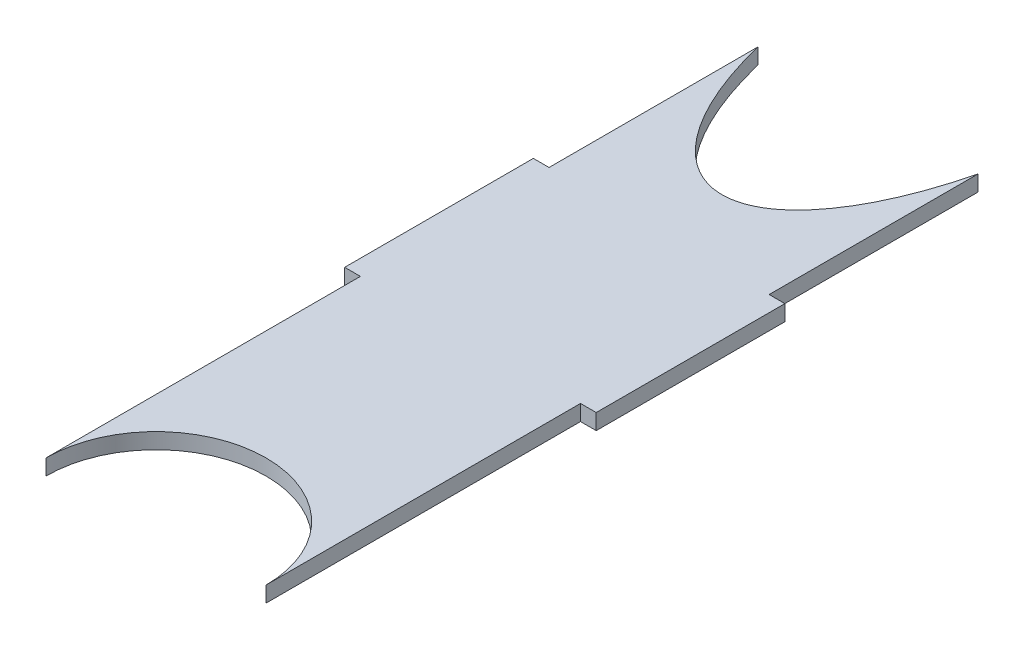
ISO-10303-21;
HEADER;
FILE_DESCRIPTION(('STEP AP214'),'2;1');
FILE_NAME('part.step','',(''),(''),'','','');
FILE_SCHEMA(('AUTOMOTIVE_DESIGN { 1 0 10303 214 1 1 1 1 }'));
ENDSEC;
DATA;
#1=APPLICATION_CONTEXT('core data for automotive mechanical design processes');
#2=APPLICATION_PROTOCOL_DEFINITION('international standard','automotive_design',2000,#1);
#3=PRODUCT_CONTEXT('',#1,'mechanical');
#4=PRODUCT('Part','Part','',(#3));
#5=PRODUCT_RELATED_PRODUCT_CATEGORY('part','',(#4));
#6=PRODUCT_DEFINITION_FORMATION('','',#4);
#7=PRODUCT_DEFINITION_CONTEXT('part definition',#1,'design');
#8=PRODUCT_DEFINITION('design','',#6,#7);
#9=PRODUCT_DEFINITION_SHAPE('','',#8);
#10=(LENGTH_UNIT() NAMED_UNIT(*) SI_UNIT(.MILLI.,.METRE.));
#11=(NAMED_UNIT(*) PLANE_ANGLE_UNIT() SI_UNIT($,.RADIAN.));
#12=(NAMED_UNIT(*) SI_UNIT($,.STERADIAN.) SOLID_ANGLE_UNIT());
#13=UNCERTAINTY_MEASURE_WITH_UNIT(LENGTH_MEASURE(1.E-05),#10,'distance_accuracy_value','');
#14=(GEOMETRIC_REPRESENTATION_CONTEXT(3) GLOBAL_UNCERTAINTY_ASSIGNED_CONTEXT((#13)) GLOBAL_UNIT_ASSIGNED_CONTEXT((#10,
#11,#12)) REPRESENTATION_CONTEXT('',''));
#15=CARTESIAN_POINT('',(0.,0.,0.));
#16=DIRECTION('',(0.,0.,1.));
#17=DIRECTION('',(1.,0.,0.));
#18=AXIS2_PLACEMENT_3D('',#15,#16,#17);
#19=CARTESIAN_POINT('',(0.,1.5875,-42.8625));
#20=DIRECTION('',(0.,1.,0.));
#21=DIRECTION('',(0.,0.,1.));
#22=AXIS2_PLACEMENT_3D('',#19,#20,#21);
#23=ELLIPSE('',#22,28.575,12.7);
#24=DIRECTION('',(0.,-1.,0.));
#25=VECTOR('',#24,1.);
#26=SURFACE_OF_LINEAR_EXTRUSION('',#23,#25);
#27=CARTESIAN_POINT('',(0.,0.,-42.8625));
#28=DIRECTION('',(0.,1.,0.));
#29=DIRECTION('',(0.,0.,1.));
#30=AXIS2_PLACEMENT_3D('',#27,#28,#29);
#31=ELLIPSE('',#30,28.575,12.7);
#32=CARTESIAN_POINT('',(-11.1125,0.,-29.0286876102654));
#33=VERTEX_POINT('',#32);
#34=CARTESIAN_POINT('',(11.1125,0.,-29.0286876102654));
#35=VERTEX_POINT('',#34);
#36=EDGE_CURVE('E155',#33,#35,#31,.T.);
#37=ORIENTED_EDGE('',*,*,#36,.F.);
#38=DIRECTION('',(0.,-1.,0.));
#39=VECTOR('',#38,1.);
#40=CARTESIAN_POINT('',(-11.1125,1.5875,-29.0286876102654));
#41=LINE('',#40,#39);
#42=CARTESIAN_POINT('',(-11.1125,1.5875,-29.0286876102654));
#43=VERTEX_POINT('',#42);
#44=EDGE_CURVE('E11',#43,#33,#41,.T.);
#45=ORIENTED_EDGE('',*,*,#44,.F.);
#46=CARTESIAN_POINT('',(11.1125,1.5875,-29.0286876102654));
#47=VERTEX_POINT('',#46);
#48=EDGE_CURVE('E259',#43,#47,#23,.T.);
#49=ORIENTED_EDGE('',*,*,#48,.T.);
#50=DIRECTION('',(0.,-1.,0.));
#51=VECTOR('',#50,1.);
#52=CARTESIAN_POINT('',(11.1125,1.5875,-29.0286876102654));
#53=LINE('',#52,#51);
#54=EDGE_CURVE('E51',#47,#35,#53,.T.);
#55=ORIENTED_EDGE('',*,*,#54,.T.);
#56=EDGE_LOOP('',(#37,#45,#49,#55));
#57=FACE_BOUND('',#56,.T.);
#58=ADVANCED_FACE('F34',(#57),#26,.T.);
#59=CARTESIAN_POINT('',(-11.1125,1.5875,0.));
#60=DIRECTION('',(1.,0.,0.));
#61=DIRECTION('',(0.,0.,-1.));
#62=AXIS2_PLACEMENT_3D('',#59,#60,#61);
#63=PLANE('',#62);
#64=DIRECTION('',(0.,0.,1.));
#65=VECTOR('',#64,1.);
#66=CARTESIAN_POINT('',(-11.1125,0.,0.));
#67=LINE('',#66,#65);
#68=CARTESIAN_POINT('',(-11.1125,0.,-7.93749999999999));
#69=VERTEX_POINT('',#68);
#70=EDGE_CURVE('E157',#33,#69,#67,.T.);
#71=ORIENTED_EDGE('',*,*,#70,.T.);
#72=DIRECTION('',(0.,-1.,0.));
#73=VECTOR('',#72,1.);
#74=CARTESIAN_POINT('',(-11.1125,1.5875,-7.93749999999999));
#75=LINE('',#74,#73);
#76=CARTESIAN_POINT('',(-11.1125,1.5875,-7.93749999999999));
#77=VERTEX_POINT('',#76);
#78=EDGE_CURVE('E43',#77,#69,#75,.T.);
#79=ORIENTED_EDGE('',*,*,#78,.F.);
#80=DIRECTION('',(0.,0.,1.));
#81=VECTOR('',#80,1.);
#82=CARTESIAN_POINT('',(-11.1125,1.5875,0.));
#83=LINE('',#82,#81);
#84=EDGE_CURVE('E221',#43,#77,#83,.T.);
#85=ORIENTED_EDGE('',*,*,#84,.F.);
#86=ORIENTED_EDGE('',*,*,#44,.T.);
#87=EDGE_LOOP('',(#71,#79,#85,#86));
#88=FACE_BOUND('',#87,.T.);
#89=ADVANCED_FACE('F252',(#88),#63,.F.);
#90=CARTESIAN_POINT('',(0.,1.5875,-7.93749999999999));
#91=DIRECTION('',(0.,0.,1.));
#92=DIRECTION('',(1.,0.,0.));
#93=AXIS2_PLACEMENT_3D('',#90,#91,#92);
#94=PLANE('',#93);
#95=DIRECTION('',(-1.,0.,0.));
#96=VECTOR('',#95,1.);
#97=CARTESIAN_POINT('',(0.,0.,-7.93749999999999));
#98=LINE('',#97,#96);
#99=CARTESIAN_POINT('',(-12.7,0.,-7.93749999999999));
#100=VERTEX_POINT('',#99);
#101=EDGE_CURVE('E159',#69,#100,#98,.T.);
#102=ORIENTED_EDGE('',*,*,#101,.T.);
#103=DIRECTION('',(0.,-1.,0.));
#104=VECTOR('',#103,1.);
#105=CARTESIAN_POINT('',(-12.7,1.5875,-7.93749999999999));
#106=LINE('',#105,#104);
#107=CARTESIAN_POINT('',(-12.7,1.5875,-7.93749999999999));
#108=VERTEX_POINT('',#107);
#109=EDGE_CURVE('E194',#108,#100,#106,.T.);
#110=ORIENTED_EDGE('',*,*,#109,.F.);
#111=DIRECTION('',(-1.,0.,0.));
#112=VECTOR('',#111,1.);
#113=CARTESIAN_POINT('',(0.,1.5875,-7.93749999999999));
#114=LINE('',#113,#112);
#115=EDGE_CURVE('E202',#77,#108,#114,.T.);
#116=ORIENTED_EDGE('',*,*,#115,.F.);
#117=ORIENTED_EDGE('',*,*,#78,.T.);
#118=EDGE_LOOP('',(#102,#110,#116,#117));
#119=FACE_BOUND('',#118,.T.);
#120=ADVANCED_FACE('F200',(#119),#94,.F.);
#121=CARTESIAN_POINT('',(-12.7,1.5875,0.));
#122=DIRECTION('',(-1.,0.,0.));
#123=DIRECTION('',(0.,0.,1.));
#124=AXIS2_PLACEMENT_3D('',#121,#122,#123);
#125=PLANE('',#124);
#126=DIRECTION('',(0.,0.,-1.));
#127=VECTOR('',#126,1.);
#128=CARTESIAN_POINT('',(-12.7,0.,0.));
#129=LINE('',#128,#127);
#130=CARTESIAN_POINT('',(-12.7,0.,11.1125));
#131=VERTEX_POINT('',#130);
#132=EDGE_CURVE('E163',#131,#100,#129,.T.);
#133=ORIENTED_EDGE('',*,*,#132,.F.);
#134=DIRECTION('',(0.,-1.,0.));
#135=VECTOR('',#134,1.);
#136=CARTESIAN_POINT('',(-12.7,1.5875,11.1125));
#137=LINE('',#136,#135);
#138=CARTESIAN_POINT('',(-12.7,1.5875,11.1125));
#139=VERTEX_POINT('',#138);
#140=EDGE_CURVE('E192',#139,#131,#137,.T.);
#141=ORIENTED_EDGE('',*,*,#140,.F.);
#142=DIRECTION('',(0.,0.,-1.));
#143=VECTOR('',#142,1.);
#144=CARTESIAN_POINT('',(-12.7,1.5875,0.));
#145=LINE('',#144,#143);
#146=EDGE_CURVE('E214',#139,#108,#145,.T.);
#147=ORIENTED_EDGE('',*,*,#146,.T.);
#148=ORIENTED_EDGE('',*,*,#109,.T.);
#149=EDGE_LOOP('',(#133,#141,#147,#148));
#150=FACE_BOUND('',#149,.T.);
#151=ADVANCED_FACE('F211',(#150),#125,.T.);
#152=CARTESIAN_POINT('',(0.,1.5875,11.1125));
#153=DIRECTION('',(0.,0.,1.));
#154=DIRECTION('',(1.,0.,0.));
#155=AXIS2_PLACEMENT_3D('',#152,#153,#154);
#156=PLANE('',#155);
#157=DIRECTION('',(-1.,0.,0.));
#158=VECTOR('',#157,1.);
#159=CARTESIAN_POINT('',(0.,0.,11.1125));
#160=LINE('',#159,#158);
#161=CARTESIAN_POINT('',(-11.1125,0.,11.1125));
#162=VERTEX_POINT('',#161);
#163=EDGE_CURVE('E166',#162,#131,#160,.T.);
#164=ORIENTED_EDGE('',*,*,#163,.F.);
#165=DIRECTION('',(0.,-1.,0.));
#166=VECTOR('',#165,1.);
#167=CARTESIAN_POINT('',(-11.1125,1.5875,11.1125));
#168=LINE('',#167,#166);
#169=CARTESIAN_POINT('',(-11.1125,1.5875,11.1125));
#170=VERTEX_POINT('',#169);
#171=EDGE_CURVE('E190',#170,#162,#168,.T.);
#172=ORIENTED_EDGE('',*,*,#171,.F.);
#173=DIRECTION('',(-1.,0.,0.));
#174=VECTOR('',#173,1.);
#175=CARTESIAN_POINT('',(0.,1.5875,11.1125));
#176=LINE('',#175,#174);
#177=EDGE_CURVE('E217',#170,#139,#176,.T.);
#178=ORIENTED_EDGE('',*,*,#177,.T.);
#179=ORIENTED_EDGE('',*,*,#140,.T.);
#180=EDGE_LOOP('',(#164,#172,#178,#179));
#181=FACE_BOUND('',#180,.T.);
#182=ADVANCED_FACE('F323',(#181),#156,.T.);
#183=CARTESIAN_POINT('',(-11.1125,0.,42.8625));
#184=VERTEX_POINT('',#183);
#185=EDGE_CURVE('E160',#162,#184,#67,.T.);
#186=ORIENTED_EDGE('',*,*,#185,.T.);
#187=DIRECTION('',(0.,-1.,0.));
#188=VECTOR('',#187,1.);
#189=CARTESIAN_POINT('',(-11.1125,1.5875,42.8625));
#190=LINE('',#189,#188);
#191=CARTESIAN_POINT('',(-11.1125,1.5875,42.8625));
#192=VERTEX_POINT('',#191);
#193=EDGE_CURVE('E188',#192,#184,#190,.T.);
#194=ORIENTED_EDGE('',*,*,#193,.F.);
#195=EDGE_CURVE('E219',#170,#192,#83,.T.);
#196=ORIENTED_EDGE('',*,*,#195,.F.);
#197=ORIENTED_EDGE('',*,*,#171,.T.);
#198=EDGE_LOOP('',(#186,#194,#196,#197));
#199=FACE_BOUND('',#198,.T.);
#200=ADVANCED_FACE('F257',(#199),#63,.F.);
#201=CARTESIAN_POINT('',(0.,1.5875,42.8625));
#202=DIRECTION('',(0.,-1.,0.));
#203=DIRECTION('',(0.,0.,-1.));
#204=AXIS2_PLACEMENT_3D('',#201,#202,#203);
#205=CYLINDRICAL_SURFACE('',#204,11.1125);
#206=CARTESIAN_POINT('',(0.,0.,42.8625));
#207=DIRECTION('',(0.,1.,0.));
#208=DIRECTION('',(0.,0.,1.));
#209=AXIS2_PLACEMENT_3D('',#206,#207,#208);
#210=CIRCLE('',#209,11.1125);
#211=CARTESIAN_POINT('',(11.1125,0.,42.8625));
#212=VERTEX_POINT('',#211);
#213=EDGE_CURVE('E169',#212,#184,#210,.T.);
#214=ORIENTED_EDGE('',*,*,#213,.F.);
#215=DIRECTION('',(0.,-1.,0.));
#216=VECTOR('',#215,1.);
#217=CARTESIAN_POINT('',(11.1125,1.5875,42.8625));
#218=LINE('',#217,#216);
#219=CARTESIAN_POINT('',(11.1125,1.5875,42.8625));
#220=VERTEX_POINT('',#219);
#221=EDGE_CURVE('E186',#220,#212,#218,.T.);
#222=ORIENTED_EDGE('',*,*,#221,.F.);
#223=CARTESIAN_POINT('',(0.,1.5875,42.8625));
#224=DIRECTION('',(0.,1.,0.));
#225=DIRECTION('',(0.,0.,1.));
#226=AXIS2_PLACEMENT_3D('',#223,#224,#225);
#227=CIRCLE('',#226,11.1125);
#228=EDGE_CURVE('E225',#220,#192,#227,.T.);
#229=ORIENTED_EDGE('',*,*,#228,.T.);
#230=ORIENTED_EDGE('',*,*,#193,.T.);
#231=EDGE_LOOP('',(#214,#222,#229,#230));
#232=FACE_BOUND('',#231,.T.);
#233=ADVANCED_FACE('F236',(#232),#205,.F.);
#234=CARTESIAN_POINT('',(11.1125,1.5875,0.));
#235=DIRECTION('',(1.,0.,0.));
#236=DIRECTION('',(0.,0.,-1.));
#237=AXIS2_PLACEMENT_3D('',#234,#235,#236);
#238=PLANE('',#237);
#239=DIRECTION('',(0.,0.,1.));
#240=VECTOR('',#239,1.);
#241=CARTESIAN_POINT('',(11.1125,0.,0.));
#242=LINE('',#241,#240);
#243=CARTESIAN_POINT('',(11.1125,0.,11.1125));
#244=VERTEX_POINT('',#243);
#245=EDGE_CURVE('E172',#244,#212,#242,.T.);
#246=ORIENTED_EDGE('',*,*,#245,.F.);
#247=DIRECTION('',(0.,-1.,0.));
#248=VECTOR('',#247,1.);
#249=CARTESIAN_POINT('',(11.1125,1.5875,11.1125));
#250=LINE('',#249,#248);
#251=CARTESIAN_POINT('',(11.1125,1.5875,11.1125));
#252=VERTEX_POINT('',#251);
#253=EDGE_CURVE('E184',#252,#244,#250,.T.);
#254=ORIENTED_EDGE('',*,*,#253,.F.);
#255=DIRECTION('',(0.,0.,1.));
#256=VECTOR('',#255,1.);
#257=CARTESIAN_POINT('',(11.1125,1.5875,0.));
#258=LINE('',#257,#256);
#259=EDGE_CURVE('E152',#252,#220,#258,.T.);
#260=ORIENTED_EDGE('',*,*,#259,.T.);
#261=ORIENTED_EDGE('',*,*,#221,.T.);
#262=EDGE_LOOP('',(#246,#254,#260,#261));
#263=FACE_BOUND('',#262,.T.);
#264=ADVANCED_FACE('F230',(#263),#238,.T.);
#265=CARTESIAN_POINT('',(0.,1.5875,11.1125));
#266=DIRECTION('',(0.,0.,-1.));
#267=DIRECTION('',(-1.,0.,0.));
#268=AXIS2_PLACEMENT_3D('',#265,#266,#267);
#269=PLANE('',#268);
#270=DIRECTION('',(1.,0.,0.));
#271=VECTOR('',#270,1.);
#272=CARTESIAN_POINT('',(0.,0.,11.1125));
#273=LINE('',#272,#271);
#274=CARTESIAN_POINT('',(12.7,0.,11.1125));
#275=VERTEX_POINT('',#274);
#276=EDGE_CURVE('E175',#244,#275,#273,.T.);
#277=ORIENTED_EDGE('',*,*,#276,.T.);
#278=DIRECTION('',(0.,-1.,0.));
#279=VECTOR('',#278,1.);
#280=CARTESIAN_POINT('',(12.7,1.5875,11.1125));
#281=LINE('',#280,#279);
#282=CARTESIAN_POINT('',(12.7,1.5875,11.1125));
#283=VERTEX_POINT('',#282);
#284=EDGE_CURVE('E146',#283,#275,#281,.T.);
#285=ORIENTED_EDGE('',*,*,#284,.F.);
#286=DIRECTION('',(1.,0.,0.));
#287=VECTOR('',#286,1.);
#288=CARTESIAN_POINT('',(0.,1.5875,11.1125));
#289=LINE('',#288,#287);
#290=EDGE_CURVE('E134',#252,#283,#289,.T.);
#291=ORIENTED_EDGE('',*,*,#290,.F.);
#292=ORIENTED_EDGE('',*,*,#253,.T.);
#293=EDGE_LOOP('',(#277,#285,#291,#292));
#294=FACE_BOUND('',#293,.T.);
#295=ADVANCED_FACE('F240',(#294),#269,.F.);
#296=CARTESIAN_POINT('',(12.7,1.5875,0.));
#297=DIRECTION('',(-1.,0.,0.));
#298=DIRECTION('',(0.,0.,1.));
#299=AXIS2_PLACEMENT_3D('',#296,#297,#298);
#300=PLANE('',#299);
#301=DIRECTION('',(0.,0.,-1.));
#302=VECTOR('',#301,1.);
#303=CARTESIAN_POINT('',(12.7,0.,0.));
#304=LINE('',#303,#302);
#305=CARTESIAN_POINT('',(12.7,0.,-7.9375));
#306=VERTEX_POINT('',#305);
#307=EDGE_CURVE('E143',#275,#306,#304,.T.);
#308=ORIENTED_EDGE('',*,*,#307,.T.);
#309=DIRECTION('',(0.,-1.,0.));
#310=VECTOR('',#309,1.);
#311=CARTESIAN_POINT('',(12.7,1.5875,-7.9375));
#312=LINE('',#311,#310);
#313=CARTESIAN_POINT('',(12.7,1.5875,-7.9375));
#314=VERTEX_POINT('',#313);
#315=EDGE_CURVE('E140',#314,#306,#312,.T.);
#316=ORIENTED_EDGE('',*,*,#315,.F.);
#317=DIRECTION('',(0.,0.,-1.));
#318=VECTOR('',#317,1.);
#319=CARTESIAN_POINT('',(12.7,1.5875,0.));
#320=LINE('',#319,#318);
#321=EDGE_CURVE('E125',#283,#314,#320,.T.);
#322=ORIENTED_EDGE('',*,*,#321,.F.);
#323=ORIENTED_EDGE('',*,*,#284,.T.);
#324=EDGE_LOOP('',(#308,#316,#322,#323));
#325=FACE_BOUND('',#324,.T.);
#326=ADVANCED_FACE('F141',(#325),#300,.F.);
#327=CARTESIAN_POINT('',(0.,1.5875,-7.93749999999998));
#328=DIRECTION('',(0.,0.,-1.));
#329=DIRECTION('',(-1.,0.,0.));
#330=AXIS2_PLACEMENT_3D('',#327,#328,#329);
#331=PLANE('',#330);
#332=DIRECTION('',(1.,0.,0.));
#333=VECTOR('',#332,1.);
#334=CARTESIAN_POINT('',(0.,0.,-7.93749999999998));
#335=LINE('',#334,#333);
#336=CARTESIAN_POINT('',(11.1125,0.,-7.9375));
#337=VERTEX_POINT('',#336);
#338=EDGE_CURVE('E179',#337,#306,#335,.T.);
#339=ORIENTED_EDGE('',*,*,#338,.F.);
#340=DIRECTION('',(0.,-1.,0.));
#341=VECTOR('',#340,1.);
#342=CARTESIAN_POINT('',(11.1125,1.5875,-7.9375));
#343=LINE('',#342,#341);
#344=CARTESIAN_POINT('',(11.1125,1.5875,-7.9375));
#345=VERTEX_POINT('',#344);
#346=EDGE_CURVE('E88',#345,#337,#343,.T.);
#347=ORIENTED_EDGE('',*,*,#346,.F.);
#348=DIRECTION('',(1.,0.,0.));
#349=VECTOR('',#348,1.);
#350=CARTESIAN_POINT('',(0.,1.5875,-7.93749999999998));
#351=LINE('',#350,#349);
#352=EDGE_CURVE('E131',#345,#314,#351,.T.);
#353=ORIENTED_EDGE('',*,*,#352,.T.);
#354=ORIENTED_EDGE('',*,*,#315,.T.);
#355=EDGE_LOOP('',(#339,#347,#353,#354));
#356=FACE_BOUND('',#355,.T.);
#357=ADVANCED_FACE('F148',(#356),#331,.T.);
#358=EDGE_CURVE('E176',#35,#337,#242,.T.);
#359=ORIENTED_EDGE('',*,*,#358,.F.);
#360=ORIENTED_EDGE('',*,*,#54,.F.);
#361=EDGE_CURVE('E149',#47,#345,#258,.T.);
#362=ORIENTED_EDGE('',*,*,#361,.T.);
#363=ORIENTED_EDGE('',*,*,#346,.T.);
#364=EDGE_LOOP('',(#359,#360,#362,#363));
#365=FACE_BOUND('',#364,.T.);
#366=ADVANCED_FACE('F249',(#365),#238,.T.);
#367=CARTESIAN_POINT('',(0.,1.5875,0.));
#368=DIRECTION('',(0.,1.,0.));
#369=DIRECTION('',(0.,0.,1.));
#370=AXIS2_PLACEMENT_3D('',#367,#368,#369);
#371=PLANE('',#370);
#372=ORIENTED_EDGE('',*,*,#48,.F.);
#373=ORIENTED_EDGE('',*,*,#84,.T.);
#374=ORIENTED_EDGE('',*,*,#115,.T.);
#375=ORIENTED_EDGE('',*,*,#146,.F.);
#376=ORIENTED_EDGE('',*,*,#177,.F.);
#377=ORIENTED_EDGE('',*,*,#195,.T.);
#378=ORIENTED_EDGE('',*,*,#228,.F.);
#379=ORIENTED_EDGE('',*,*,#259,.F.);
#380=ORIENTED_EDGE('',*,*,#290,.T.);
#381=ORIENTED_EDGE('',*,*,#321,.T.);
#382=ORIENTED_EDGE('',*,*,#352,.F.);
#383=ORIENTED_EDGE('',*,*,#361,.F.);
#384=EDGE_LOOP('',(#372,#373,#374,#375,#376,#377,#378,#379,#380,#381,#382,#383));
#385=FACE_BOUND('',#384,.T.);
#386=ADVANCED_FACE('F128',(#385),#371,.T.);
#387=CARTESIAN_POINT('',(0.,0.,0.));
#388=DIRECTION('',(0.,1.,0.));
#389=DIRECTION('',(0.,0.,1.));
#390=AXIS2_PLACEMENT_3D('',#387,#388,#389);
#391=PLANE('',#390);
#392=ORIENTED_EDGE('',*,*,#36,.T.);
#393=ORIENTED_EDGE('',*,*,#358,.T.);
#394=ORIENTED_EDGE('',*,*,#338,.T.);
#395=ORIENTED_EDGE('',*,*,#307,.F.);
#396=ORIENTED_EDGE('',*,*,#276,.F.);
#397=ORIENTED_EDGE('',*,*,#245,.T.);
#398=ORIENTED_EDGE('',*,*,#213,.T.);
#399=ORIENTED_EDGE('',*,*,#185,.F.);
#400=ORIENTED_EDGE('',*,*,#163,.T.);
#401=ORIENTED_EDGE('',*,*,#132,.T.);
#402=ORIENTED_EDGE('',*,*,#101,.F.);
#403=ORIENTED_EDGE('',*,*,#70,.F.);
#404=EDGE_LOOP('',(#392,#393,#394,#395,#396,#397,#398,#399,#400,#401,#402,#403));
#405=FACE_BOUND('',#404,.T.);
#406=ADVANCED_FACE('F206',(#405),#391,.F.);
#407=CLOSED_SHELL('',(#58,#89,#120,#151,#182,#200,#233,#264,#295,#326,#357,#366,#386,#406));
#408=MANIFOLD_SOLID_BREP('B2',#407);
#409=ADVANCED_BREP_SHAPE_REPRESENTATION('',(#18,#408),#14);
#410=SHAPE_DEFINITION_REPRESENTATION(#9,#409);
ENDSEC;
END-ISO-10303-21;
